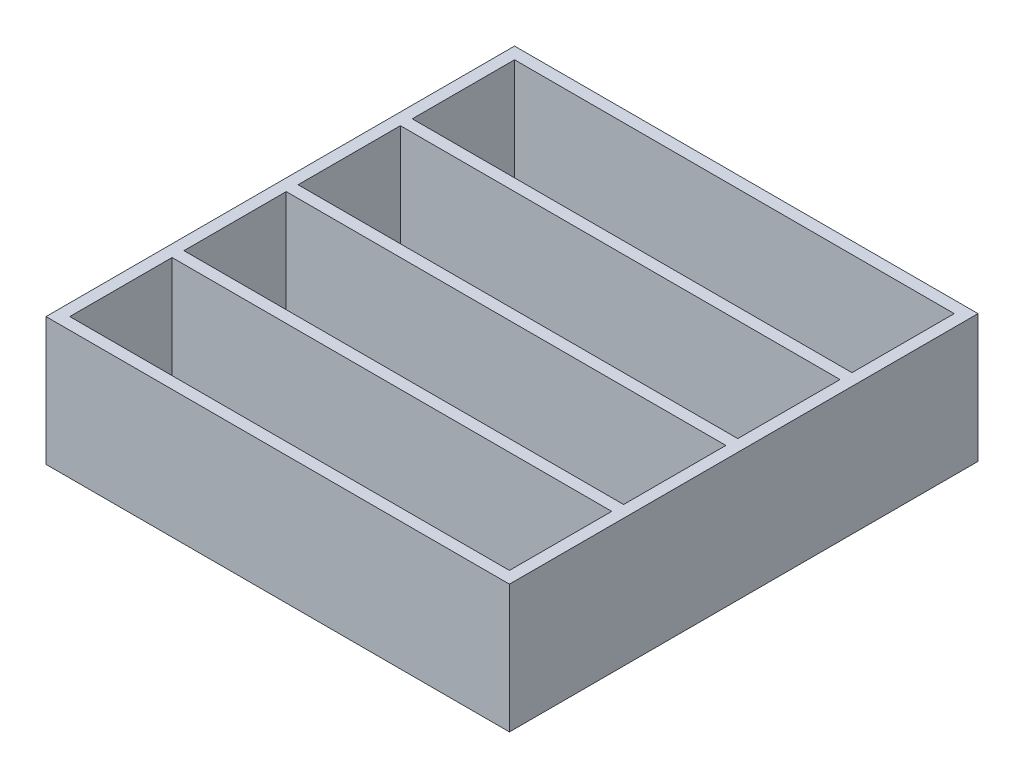
ISO-10303-21;
HEADER;
FILE_DESCRIPTION(('STEP AP214'),'2;1');
FILE_NAME('part.step','',(''),(''),'','','');
FILE_SCHEMA(('AUTOMOTIVE_DESIGN { 1 0 10303 214 1 1 1 1 }'));
ENDSEC;
DATA;
#1=APPLICATION_CONTEXT('core data for automotive mechanical design processes');
#2=APPLICATION_PROTOCOL_DEFINITION('international standard','automotive_design',2000,#1);
#3=PRODUCT_CONTEXT('',#1,'mechanical');
#4=PRODUCT('Part','Part','',(#3));
#5=PRODUCT_RELATED_PRODUCT_CATEGORY('part','',(#4));
#6=PRODUCT_DEFINITION_FORMATION('','',#4);
#7=PRODUCT_DEFINITION_CONTEXT('part definition',#1,'design');
#8=PRODUCT_DEFINITION('design','',#6,#7);
#9=PRODUCT_DEFINITION_SHAPE('','',#8);
#10=(LENGTH_UNIT() NAMED_UNIT(*) SI_UNIT(.MILLI.,.METRE.));
#11=(NAMED_UNIT(*) PLANE_ANGLE_UNIT() SI_UNIT($,.RADIAN.));
#12=(NAMED_UNIT(*) SI_UNIT($,.STERADIAN.) SOLID_ANGLE_UNIT());
#13=UNCERTAINTY_MEASURE_WITH_UNIT(LENGTH_MEASURE(1.E-05),#10,'distance_accuracy_value','');
#14=(GEOMETRIC_REPRESENTATION_CONTEXT(3) GLOBAL_UNCERTAINTY_ASSIGNED_CONTEXT((#13)) GLOBAL_UNIT_ASSIGNED_CONTEXT((#10,
#11,#12)) REPRESENTATION_CONTEXT('',''));
#15=CARTESIAN_POINT('',(0.,0.,0.));
#16=DIRECTION('',(0.,0.,1.));
#17=DIRECTION('',(1.,0.,0.));
#18=AXIS2_PLACEMENT_3D('',#15,#16,#17);
#19=CARTESIAN_POINT('',(-65.4717307692308,21.54,18.3833653846154));
#20=DIRECTION('',(1.,0.,0.));
#21=DIRECTION('',(0.,0.,-1.));
#22=AXIS2_PLACEMENT_3D('',#19,#20,#21);
#23=PLANE('',#22);
#24=DIRECTION('',(0.,0.,1.));
#25=VECTOR('',#24,1.);
#26=CARTESIAN_POINT('',(-65.4717307692308,0.,18.3833653846154));
#27=LINE('',#26,#25);
#28=CARTESIAN_POINT('',(-65.4717307692308,0.,-60.4566346153846));
#29=VERTEX_POINT('',#28);
#30=CARTESIAN_POINT('',(-65.4717307692308,0.,18.3833653846154));
#31=VERTEX_POINT('',#30);
#32=EDGE_CURVE('E222',#29,#31,#27,.T.);
#33=ORIENTED_EDGE('',*,*,#32,.T.);
#34=DIRECTION('',(0.,-1.,0.));
#35=VECTOR('',#34,1.);
#36=CARTESIAN_POINT('',(-65.4717307692308,21.54,18.3833653846154));
#37=LINE('',#36,#35);
#38=CARTESIAN_POINT('',(-65.4717307692308,21.54,18.3833653846154));
#39=VERTEX_POINT('',#38);
#40=EDGE_CURVE('E11',#39,#31,#37,.T.);
#41=ORIENTED_EDGE('',*,*,#40,.F.);
#42=DIRECTION('',(0.,0.,1.));
#43=VECTOR('',#42,1.);
#44=CARTESIAN_POINT('',(-65.4717307692308,21.54,18.3833653846154));
#45=LINE('',#44,#43);
#46=CARTESIAN_POINT('',(-65.4717307692308,21.54,-60.4566346153846));
#47=VERTEX_POINT('',#46);
#48=EDGE_CURVE('E357',#47,#39,#45,.T.);
#49=ORIENTED_EDGE('',*,*,#48,.F.);
#50=DIRECTION('',(0.,-1.,0.));
#51=VECTOR('',#50,1.);
#52=CARTESIAN_POINT('',(-65.4717307692308,21.54,-60.4566346153846));
#53=LINE('',#52,#51);
#54=EDGE_CURVE('E371',#47,#29,#53,.T.);
#55=ORIENTED_EDGE('',*,*,#54,.T.);
#56=EDGE_LOOP('',(#33,#41,#49,#55));
#57=FACE_BOUND('',#56,.T.);
#58=ADVANCED_FACE('F39',(#57),#23,.F.);
#59=CARTESIAN_POINT('',(-65.4717307692308,21.54,18.3833653846154));
#60=DIRECTION('',(0.,0.,-1.));
#61=DIRECTION('',(-1.,0.,0.));
#62=AXIS2_PLACEMENT_3D('',#59,#60,#61);
#63=PLANE('',#62);
#64=DIRECTION('',(1.,0.,0.));
#65=VECTOR('',#64,1.);
#66=CARTESIAN_POINT('',(-65.4717307692308,0.,18.3833653846154));
#67=LINE('',#66,#65);
#68=CARTESIAN_POINT('',(12.5082692307692,0.,18.3833653846154));
#69=VERTEX_POINT('',#68);
#70=EDGE_CURVE('E375',#31,#69,#67,.T.);
#71=ORIENTED_EDGE('',*,*,#70,.T.);
#72=DIRECTION('',(0.,-1.,0.));
#73=VECTOR('',#72,1.);
#74=CARTESIAN_POINT('',(12.5082692307692,21.54,18.3833653846154));
#75=LINE('',#74,#73);
#76=CARTESIAN_POINT('',(12.5082692307692,21.54,18.3833653846154));
#77=VERTEX_POINT('',#76);
#78=EDGE_CURVE('E47',#77,#69,#75,.T.);
#79=ORIENTED_EDGE('',*,*,#78,.F.);
#80=DIRECTION('',(1.,0.,0.));
#81=VECTOR('',#80,1.);
#82=CARTESIAN_POINT('',(-65.4717307692308,21.54,18.3833653846154));
#83=LINE('',#82,#81);
#84=EDGE_CURVE('E361',#39,#77,#83,.T.);
#85=ORIENTED_EDGE('',*,*,#84,.F.);
#86=ORIENTED_EDGE('',*,*,#40,.T.);
#87=EDGE_LOOP('',(#71,#79,#85,#86));
#88=FACE_BOUND('',#87,.T.);
#89=ADVANCED_FACE('F411',(#88),#63,.F.);
#90=CARTESIAN_POINT('',(12.5082692307692,21.54,18.3833653846154));
#91=DIRECTION('',(-1.,0.,0.));
#92=DIRECTION('',(0.,0.,1.));
#93=AXIS2_PLACEMENT_3D('',#90,#91,#92);
#94=PLANE('',#93);
#95=DIRECTION('',(0.,0.,-1.));
#96=VECTOR('',#95,1.);
#97=CARTESIAN_POINT('',(12.5082692307692,0.,18.3833653846154));
#98=LINE('',#97,#96);
#99=CARTESIAN_POINT('',(12.5082692307692,0.,-60.4566346153846));
#100=VERTEX_POINT('',#99);
#101=EDGE_CURVE('E378',#69,#100,#98,.T.);
#102=ORIENTED_EDGE('',*,*,#101,.T.);
#103=DIRECTION('',(0.,-1.,0.));
#104=VECTOR('',#103,1.);
#105=CARTESIAN_POINT('',(12.5082692307692,21.54,-60.4566346153846));
#106=LINE('',#105,#104);
#107=CARTESIAN_POINT('',(12.5082692307692,21.54,-60.4566346153846));
#108=VERTEX_POINT('',#107);
#109=EDGE_CURVE('E386',#108,#100,#106,.T.);
#110=ORIENTED_EDGE('',*,*,#109,.F.);
#111=DIRECTION('',(0.,0.,-1.));
#112=VECTOR('',#111,1.);
#113=CARTESIAN_POINT('',(12.5082692307692,21.54,18.3833653846154));
#114=LINE('',#113,#112);
#115=EDGE_CURVE('E365',#77,#108,#114,.T.);
#116=ORIENTED_EDGE('',*,*,#115,.F.);
#117=ORIENTED_EDGE('',*,*,#78,.T.);
#118=EDGE_LOOP('',(#102,#110,#116,#117));
#119=FACE_BOUND('',#118,.T.);
#120=ADVANCED_FACE('F395',(#119),#94,.F.);
#121=CARTESIAN_POINT('',(-65.4717307692308,21.54,-60.4566346153846));
#122=DIRECTION('',(0.,0.,1.));
#123=DIRECTION('',(1.,0.,0.));
#124=AXIS2_PLACEMENT_3D('',#121,#122,#123);
#125=PLANE('',#124);
#126=DIRECTION('',(-1.,0.,0.));
#127=VECTOR('',#126,1.);
#128=CARTESIAN_POINT('',(-65.4717307692308,0.,-60.4566346153846));
#129=LINE('',#128,#127);
#130=EDGE_CURVE('E362',#100,#29,#129,.T.);
#131=ORIENTED_EDGE('',*,*,#130,.T.);
#132=ORIENTED_EDGE('',*,*,#54,.F.);
#133=DIRECTION('',(-1.,0.,0.));
#134=VECTOR('',#133,1.);
#135=CARTESIAN_POINT('',(-65.4717307692308,21.54,-60.4566346153846));
#136=LINE('',#135,#134);
#137=EDGE_CURVE('E368',#108,#47,#136,.T.);
#138=ORIENTED_EDGE('',*,*,#137,.F.);
#139=ORIENTED_EDGE('',*,*,#109,.T.);
#140=EDGE_LOOP('',(#131,#132,#138,#139));
#141=FACE_BOUND('',#140,.T.);
#142=ADVANCED_FACE('F404',(#141),#125,.F.);
#143=CARTESIAN_POINT('',(0.,21.54,0.));
#144=DIRECTION('',(0.,-1.,0.));
#145=DIRECTION('',(0.,0.,-1.));
#146=AXIS2_PLACEMENT_3D('',#143,#144,#145);
#147=PLANE('',#146);
#148=DIRECTION('',(-1.,0.,0.));
#149=VECTOR('',#148,1.);
#150=CARTESIAN_POINT('',(10.5082692307692,21.54,-0.826634615384606));
#151=LINE('',#150,#149);
#152=CARTESIAN_POINT('',(10.5082692307692,21.54,-0.826634615384606));
#153=VERTEX_POINT('',#152);
#154=CARTESIAN_POINT('',(-63.4717307692308,21.54,-0.826634615384597));
#155=VERTEX_POINT('',#154);
#156=EDGE_CURVE('E212',#153,#155,#151,.T.);
#157=ORIENTED_EDGE('',*,*,#156,.F.);
#158=DIRECTION('',(0.,0.,-1.));
#159=VECTOR('',#158,1.);
#160=CARTESIAN_POINT('',(10.5082692307692,21.54,16.3833653846154));
#161=LINE('',#160,#159);
#162=CARTESIAN_POINT('',(10.5082692307692,21.54,16.3833653846154));
#163=VERTEX_POINT('',#162);
#164=EDGE_CURVE('E54',#163,#153,#161,.T.);
#165=ORIENTED_EDGE('',*,*,#164,.F.);
#166=DIRECTION('',(1.,0.,0.));
#167=VECTOR('',#166,1.);
#168=CARTESIAN_POINT('',(10.5082692307692,21.54,16.3833653846154));
#169=LINE('',#168,#167);
#170=CARTESIAN_POINT('',(-63.4717307692308,21.54,16.3833653846154));
#171=VERTEX_POINT('',#170);
#172=EDGE_CURVE('E199',#171,#163,#169,.T.);
#173=ORIENTED_EDGE('',*,*,#172,.F.);
#174=DIRECTION('',(0.,0.,1.));
#175=VECTOR('',#174,1.);
#176=CARTESIAN_POINT('',(-63.4717307692308,21.54,16.3833653846154));
#177=LINE('',#176,#175);
#178=EDGE_CURVE('E203',#155,#171,#177,.T.);
#179=ORIENTED_EDGE('',*,*,#178,.F.);
#180=EDGE_LOOP('',(#157,#165,#173,#179));
#181=FACE_BOUND('',#180,.T.);
#182=DIRECTION('',(-1.,0.,0.));
#183=VECTOR('',#182,1.);
#184=CARTESIAN_POINT('',(10.5082692307692,21.54,-20.0366346153846));
#185=LINE('',#184,#183);
#186=CARTESIAN_POINT('',(10.5082692307692,21.54,-20.0366346153846));
#187=VERTEX_POINT('',#186);
#188=CARTESIAN_POINT('',(-63.4717307692308,21.54,-20.0366346153846));
#189=VERTEX_POINT('',#188);
#190=EDGE_CURVE('E248',#187,#189,#185,.T.);
#191=ORIENTED_EDGE('',*,*,#190,.F.);
#192=DIRECTION('',(0.,0.,-1.));
#193=VECTOR('',#192,1.);
#194=CARTESIAN_POINT('',(10.5082692307692,21.54,-2.82663461538461));
#195=LINE('',#194,#193);
#196=CARTESIAN_POINT('',(10.5082692307692,21.54,-2.82663461538461));
#197=VERTEX_POINT('',#196);
#198=EDGE_CURVE('E62',#197,#187,#195,.T.);
#199=ORIENTED_EDGE('',*,*,#198,.F.);
#200=DIRECTION('',(1.,0.,0.));
#201=VECTOR('',#200,1.);
#202=CARTESIAN_POINT('',(10.5082692307692,21.54,-2.82663461538461));
#203=LINE('',#202,#201);
#204=CARTESIAN_POINT('',(-63.4717307692308,21.54,-2.8266346153846));
#205=VERTEX_POINT('',#204);
#206=EDGE_CURVE('E233',#205,#197,#203,.T.);
#207=ORIENTED_EDGE('',*,*,#206,.F.);
#208=DIRECTION('',(0.,0.,1.));
#209=VECTOR('',#208,1.);
#210=CARTESIAN_POINT('',(-63.4717307692308,21.54,-2.8266346153846));
#211=LINE('',#210,#209);
#212=EDGE_CURVE('E253',#189,#205,#211,.T.);
#213=ORIENTED_EDGE('',*,*,#212,.F.);
#214=EDGE_LOOP('',(#191,#199,#207,#213));
#215=FACE_BOUND('',#214,.T.);
#216=DIRECTION('',(-1.,0.,0.));
#217=VECTOR('',#216,1.);
#218=CARTESIAN_POINT('',(10.5082692307692,21.54,-39.2466346153847));
#219=LINE('',#218,#217);
#220=CARTESIAN_POINT('',(10.5082692307692,21.54,-39.2466346153847));
#221=VERTEX_POINT('',#220);
#222=CARTESIAN_POINT('',(-63.4717307692308,21.54,-39.2466346153846));
#223=VERTEX_POINT('',#222);
#224=EDGE_CURVE('E291',#221,#223,#219,.T.);
#225=ORIENTED_EDGE('',*,*,#224,.F.);
#226=DIRECTION('',(0.,0.,-1.));
#227=VECTOR('',#226,1.);
#228=CARTESIAN_POINT('',(10.5082692307692,21.54,-22.0366346153846));
#229=LINE('',#228,#227);
#230=CARTESIAN_POINT('',(10.5082692307692,21.54,-22.0366346153846));
#231=VERTEX_POINT('',#230);
#232=EDGE_CURVE('E288',#231,#221,#229,.T.);
#233=ORIENTED_EDGE('',*,*,#232,.F.);
#234=DIRECTION('',(1.,0.,0.));
#235=VECTOR('',#234,1.);
#236=CARTESIAN_POINT('',(10.5082692307692,21.54,-22.0366346153846));
#237=LINE('',#236,#235);
#238=CARTESIAN_POINT('',(-63.4717307692308,21.54,-22.0366346153846));
#239=VERTEX_POINT('',#238);
#240=EDGE_CURVE('E275',#239,#231,#237,.T.);
#241=ORIENTED_EDGE('',*,*,#240,.F.);
#242=DIRECTION('',(0.,0.,1.));
#243=VECTOR('',#242,1.);
#244=CARTESIAN_POINT('',(-63.4717307692308,21.54,-22.0366346153846));
#245=LINE('',#244,#243);
#246=EDGE_CURVE('E296',#223,#239,#245,.T.);
#247=ORIENTED_EDGE('',*,*,#246,.F.);
#248=EDGE_LOOP('',(#225,#233,#241,#247));
#249=FACE_BOUND('',#248,.T.);
#250=DIRECTION('',(-1.,0.,0.));
#251=VECTOR('',#250,1.);
#252=CARTESIAN_POINT('',(10.5082692307692,21.54,-58.4566346153846));
#253=LINE('',#252,#251);
#254=CARTESIAN_POINT('',(10.5082692307692,21.54,-58.4566346153846));
#255=VERTEX_POINT('',#254);
#256=CARTESIAN_POINT('',(-63.4717307692308,21.54,-58.4566346153846));
#257=VERTEX_POINT('',#256);
#258=EDGE_CURVE('E335',#255,#257,#253,.T.);
#259=ORIENTED_EDGE('',*,*,#258,.F.);
#260=DIRECTION('',(0.,0.,-1.));
#261=VECTOR('',#260,1.);
#262=CARTESIAN_POINT('',(10.5082692307692,21.54,-41.2466346153847));
#263=LINE('',#262,#261);
#264=CARTESIAN_POINT('',(10.5082692307692,21.54,-41.2466346153847));
#265=VERTEX_POINT('',#264);
#266=EDGE_CURVE('E332',#265,#255,#263,.T.);
#267=ORIENTED_EDGE('',*,*,#266,.F.);
#268=DIRECTION('',(1.,0.,0.));
#269=VECTOR('',#268,1.);
#270=CARTESIAN_POINT('',(10.5082692307692,21.54,-41.2466346153847));
#271=LINE('',#270,#269);
#272=CARTESIAN_POINT('',(-63.4717307692308,21.54,-41.2466346153846));
#273=VERTEX_POINT('',#272);
#274=EDGE_CURVE('E319',#273,#265,#271,.T.);
#275=ORIENTED_EDGE('',*,*,#274,.F.);
#276=DIRECTION('',(0.,0.,1.));
#277=VECTOR('',#276,1.);
#278=CARTESIAN_POINT('',(-63.4717307692308,21.54,-41.2466346153846));
#279=LINE('',#278,#277);
#280=EDGE_CURVE('E339',#257,#273,#279,.T.);
#281=ORIENTED_EDGE('',*,*,#280,.F.);
#282=EDGE_LOOP('',(#259,#267,#275,#281));
#283=FACE_BOUND('',#282,.T.);
#284=ORIENTED_EDGE('',*,*,#48,.T.);
#285=ORIENTED_EDGE('',*,*,#84,.T.);
#286=ORIENTED_EDGE('',*,*,#115,.T.);
#287=ORIENTED_EDGE('',*,*,#137,.T.);
#288=EDGE_LOOP('',(#284,#285,#286,#287));
#289=FACE_BOUND('',#288,.T.);
#290=ADVANCED_FACE('F410',(#181,#215,#249,#283,#289),#147,.F.);
#291=CARTESIAN_POINT('',(0.,0.,0.));
#292=DIRECTION('',(0.,-1.,0.));
#293=DIRECTION('',(0.,0.,-1.));
#294=AXIS2_PLACEMENT_3D('',#291,#292,#293);
#295=PLANE('',#294);
#296=ORIENTED_EDGE('',*,*,#32,.F.);
#297=ORIENTED_EDGE('',*,*,#130,.F.);
#298=ORIENTED_EDGE('',*,*,#101,.F.);
#299=ORIENTED_EDGE('',*,*,#70,.F.);
#300=EDGE_LOOP('',(#296,#297,#298,#299));
#301=FACE_BOUND('',#300,.T.);
#302=ADVANCED_FACE('F401',(#301),#295,.T.);
#303=CARTESIAN_POINT('',(10.5082692307692,2.,-41.2466346153847));
#304=DIRECTION('',(1.,0.,0.));
#305=DIRECTION('',(0.,0.,-1.));
#306=AXIS2_PLACEMENT_3D('',#303,#304,#305);
#307=PLANE('',#306);
#308=ORIENTED_EDGE('',*,*,#266,.T.);
#309=DIRECTION('',(0.,1.,0.));
#310=VECTOR('',#309,1.);
#311=CARTESIAN_POINT('',(10.5082692307692,2.,-58.4566346153846));
#312=LINE('',#311,#310);
#313=CARTESIAN_POINT('',(10.5082692307692,2.,-58.4566346153846));
#314=VERTEX_POINT('',#313);
#315=EDGE_CURVE('E331',#314,#255,#312,.T.);
#316=ORIENTED_EDGE('',*,*,#315,.F.);
#317=DIRECTION('',(0.,0.,-1.));
#318=VECTOR('',#317,1.);
#319=CARTESIAN_POINT('',(10.5082692307692,2.,-41.2466346153847));
#320=LINE('',#319,#318);
#321=CARTESIAN_POINT('',(10.5082692307692,2.,-41.2466346153847));
#322=VERTEX_POINT('',#321);
#323=EDGE_CURVE('E314',#322,#314,#320,.T.);
#324=ORIENTED_EDGE('',*,*,#323,.F.);
#325=DIRECTION('',(0.,1.,0.));
#326=VECTOR('',#325,1.);
#327=CARTESIAN_POINT('',(10.5082692307692,2.,-41.2466346153847));
#328=LINE('',#327,#326);
#329=EDGE_CURVE('E292',#322,#265,#328,.T.);
#330=ORIENTED_EDGE('',*,*,#329,.T.);
#331=EDGE_LOOP('',(#308,#316,#324,#330));
#332=FACE_BOUND('',#331,.T.);
#333=ADVANCED_FACE('F423',(#332),#307,.F.);
#334=CARTESIAN_POINT('',(10.5082692307692,2.,-41.2466346153847));
#335=DIRECTION('',(0.,0.,1.));
#336=DIRECTION('',(1.,0.,0.));
#337=AXIS2_PLACEMENT_3D('',#334,#335,#336);
#338=PLANE('',#337);
#339=ORIENTED_EDGE('',*,*,#274,.T.);
#340=ORIENTED_EDGE('',*,*,#329,.F.);
#341=DIRECTION('',(1.,0.,0.));
#342=VECTOR('',#341,1.);
#343=CARTESIAN_POINT('',(10.5082692307692,2.,-41.2466346153847));
#344=LINE('',#343,#342);
#345=CARTESIAN_POINT('',(-63.4717307692308,2.,-41.2466346153846));
#346=VERTEX_POINT('',#345);
#347=EDGE_CURVE('E327',#346,#322,#344,.T.);
#348=ORIENTED_EDGE('',*,*,#347,.F.);
#349=DIRECTION('',(0.,1.,0.));
#350=VECTOR('',#349,1.);
#351=CARTESIAN_POINT('',(-63.4717307692308,2.,-41.2466346153846));
#352=LINE('',#351,#350);
#353=EDGE_CURVE('E348',#346,#273,#352,.T.);
#354=ORIENTED_EDGE('',*,*,#353,.T.);
#355=EDGE_LOOP('',(#339,#340,#348,#354));
#356=FACE_BOUND('',#355,.T.);
#357=ADVANCED_FACE('F429',(#356),#338,.F.);
#358=CARTESIAN_POINT('',(-63.4717307692308,2.,-41.2466346153846));
#359=DIRECTION('',(-1.,0.,0.));
#360=DIRECTION('',(0.,0.,1.));
#361=AXIS2_PLACEMENT_3D('',#358,#359,#360);
#362=PLANE('',#361);
#363=ORIENTED_EDGE('',*,*,#280,.T.);
#364=ORIENTED_EDGE('',*,*,#353,.F.);
#365=DIRECTION('',(0.,0.,1.));
#366=VECTOR('',#365,1.);
#367=CARTESIAN_POINT('',(-63.4717307692308,2.,-41.2466346153846));
#368=LINE('',#367,#366);
#369=CARTESIAN_POINT('',(-63.4717307692308,2.,-58.4566346153846));
#370=VERTEX_POINT('',#369);
#371=EDGE_CURVE('E323',#370,#346,#368,.T.);
#372=ORIENTED_EDGE('',*,*,#371,.F.);
#373=DIRECTION('',(0.,1.,0.));
#374=VECTOR('',#373,1.);
#375=CARTESIAN_POINT('',(-63.4717307692308,2.,-58.4566346153846));
#376=LINE('',#375,#374);
#377=EDGE_CURVE('E351',#370,#257,#376,.T.);
#378=ORIENTED_EDGE('',*,*,#377,.T.);
#379=EDGE_LOOP('',(#363,#364,#372,#378));
#380=FACE_BOUND('',#379,.T.);
#381=ADVANCED_FACE('F435',(#380),#362,.F.);
#382=CARTESIAN_POINT('',(10.5082692307692,2.,-58.4566346153846));
#383=DIRECTION('',(0.,0.,-1.));
#384=DIRECTION('',(-1.,0.,0.));
#385=AXIS2_PLACEMENT_3D('',#382,#383,#384);
#386=PLANE('',#385);
#387=ORIENTED_EDGE('',*,*,#258,.T.);
#388=ORIENTED_EDGE('',*,*,#377,.F.);
#389=DIRECTION('',(-1.,0.,0.));
#390=VECTOR('',#389,1.);
#391=CARTESIAN_POINT('',(10.5082692307692,2.,-58.4566346153846));
#392=LINE('',#391,#390);
#393=EDGE_CURVE('E318',#314,#370,#392,.T.);
#394=ORIENTED_EDGE('',*,*,#393,.F.);
#395=ORIENTED_EDGE('',*,*,#315,.T.);
#396=EDGE_LOOP('',(#387,#388,#394,#395));
#397=FACE_BOUND('',#396,.T.);
#398=ADVANCED_FACE('F431',(#397),#386,.F.);
#399=CARTESIAN_POINT('',(0.,2.,0.));
#400=DIRECTION('',(0.,1.,0.));
#401=DIRECTION('',(0.,0.,1.));
#402=AXIS2_PLACEMENT_3D('',#399,#400,#401);
#403=PLANE('',#402);
#404=ORIENTED_EDGE('',*,*,#323,.T.);
#405=ORIENTED_EDGE('',*,*,#393,.T.);
#406=ORIENTED_EDGE('',*,*,#371,.T.);
#407=ORIENTED_EDGE('',*,*,#347,.T.);
#408=EDGE_LOOP('',(#404,#405,#406,#407));
#409=FACE_BOUND('',#408,.T.);
#410=ADVANCED_FACE('F434',(#409),#403,.T.);
#411=CARTESIAN_POINT('',(10.5082692307692,2.,-22.0366346153846));
#412=DIRECTION('',(1.,0.,0.));
#413=DIRECTION('',(0.,0.,-1.));
#414=AXIS2_PLACEMENT_3D('',#411,#412,#413);
#415=PLANE('',#414);
#416=ORIENTED_EDGE('',*,*,#232,.T.);
#417=DIRECTION('',(0.,1.,0.));
#418=VECTOR('',#417,1.);
#419=CARTESIAN_POINT('',(10.5082692307692,2.,-39.2466346153847));
#420=LINE('',#419,#418);
#421=CARTESIAN_POINT('',(10.5082692307692,2.,-39.2466346153847));
#422=VERTEX_POINT('',#421);
#423=EDGE_CURVE('E287',#422,#221,#420,.T.);
#424=ORIENTED_EDGE('',*,*,#423,.F.);
#425=DIRECTION('',(0.,0.,-1.));
#426=VECTOR('',#425,1.);
#427=CARTESIAN_POINT('',(10.5082692307692,2.,-22.0366346153846));
#428=LINE('',#427,#426);
#429=CARTESIAN_POINT('',(10.5082692307692,2.,-22.0366346153846));
#430=VERTEX_POINT('',#429);
#431=EDGE_CURVE('E270',#430,#422,#428,.T.);
#432=ORIENTED_EDGE('',*,*,#431,.F.);
#433=DIRECTION('',(0.,1.,0.));
#434=VECTOR('',#433,1.);
#435=CARTESIAN_POINT('',(10.5082692307692,2.,-22.0366346153846));
#436=LINE('',#435,#434);
#437=EDGE_CURVE('E249',#430,#231,#436,.T.);
#438=ORIENTED_EDGE('',*,*,#437,.T.);
#439=EDGE_LOOP('',(#416,#424,#432,#438));
#440=FACE_BOUND('',#439,.T.);
#441=ADVANCED_FACE('F445',(#440),#415,.F.);
#442=CARTESIAN_POINT('',(10.5082692307692,2.,-22.0366346153846));
#443=DIRECTION('',(0.,0.,1.));
#444=DIRECTION('',(1.,0.,0.));
#445=AXIS2_PLACEMENT_3D('',#442,#443,#444);
#446=PLANE('',#445);
#447=ORIENTED_EDGE('',*,*,#240,.T.);
#448=ORIENTED_EDGE('',*,*,#437,.F.);
#449=DIRECTION('',(1.,0.,0.));
#450=VECTOR('',#449,1.);
#451=CARTESIAN_POINT('',(10.5082692307692,2.,-22.0366346153846));
#452=LINE('',#451,#450);
#453=CARTESIAN_POINT('',(-63.4717307692308,2.,-22.0366346153846));
#454=VERTEX_POINT('',#453);
#455=EDGE_CURVE('E283',#454,#430,#452,.T.);
#456=ORIENTED_EDGE('',*,*,#455,.F.);
#457=DIRECTION('',(0.,1.,0.));
#458=VECTOR('',#457,1.);
#459=CARTESIAN_POINT('',(-63.4717307692308,2.,-22.0366346153846));
#460=LINE('',#459,#458);
#461=EDGE_CURVE('E305',#454,#239,#460,.T.);
#462=ORIENTED_EDGE('',*,*,#461,.T.);
#463=EDGE_LOOP('',(#447,#448,#456,#462));
#464=FACE_BOUND('',#463,.T.);
#465=ADVANCED_FACE('F449',(#464),#446,.F.);
#466=CARTESIAN_POINT('',(-63.4717307692308,2.,-22.0366346153846));
#467=DIRECTION('',(-1.,0.,0.));
#468=DIRECTION('',(0.,0.,1.));
#469=AXIS2_PLACEMENT_3D('',#466,#467,#468);
#470=PLANE('',#469);
#471=ORIENTED_EDGE('',*,*,#246,.T.);
#472=ORIENTED_EDGE('',*,*,#461,.F.);
#473=DIRECTION('',(0.,0.,1.));
#474=VECTOR('',#473,1.);
#475=CARTESIAN_POINT('',(-63.4717307692308,2.,-22.0366346153846));
#476=LINE('',#475,#474);
#477=CARTESIAN_POINT('',(-63.4717307692308,2.,-39.2466346153846));
#478=VERTEX_POINT('',#477);
#479=EDGE_CURVE('E279',#478,#454,#476,.T.);
#480=ORIENTED_EDGE('',*,*,#479,.F.);
#481=DIRECTION('',(0.,1.,0.));
#482=VECTOR('',#481,1.);
#483=CARTESIAN_POINT('',(-63.4717307692308,2.,-39.2466346153846));
#484=LINE('',#483,#482);
#485=EDGE_CURVE('E308',#478,#223,#484,.T.);
#486=ORIENTED_EDGE('',*,*,#485,.T.);
#487=EDGE_LOOP('',(#471,#472,#480,#486));
#488=FACE_BOUND('',#487,.T.);
#489=ADVANCED_FACE('F455',(#488),#470,.F.);
#490=CARTESIAN_POINT('',(10.5082692307692,2.,-39.2466346153847));
#491=DIRECTION('',(0.,0.,-1.));
#492=DIRECTION('',(-1.,0.,0.));
#493=AXIS2_PLACEMENT_3D('',#490,#491,#492);
#494=PLANE('',#493);
#495=ORIENTED_EDGE('',*,*,#224,.T.);
#496=ORIENTED_EDGE('',*,*,#485,.F.);
#497=DIRECTION('',(-1.,0.,0.));
#498=VECTOR('',#497,1.);
#499=CARTESIAN_POINT('',(10.5082692307692,2.,-39.2466346153847));
#500=LINE('',#499,#498);
#501=EDGE_CURVE('E274',#422,#478,#500,.T.);
#502=ORIENTED_EDGE('',*,*,#501,.F.);
#503=ORIENTED_EDGE('',*,*,#423,.T.);
#504=EDGE_LOOP('',(#495,#496,#502,#503));
#505=FACE_BOUND('',#504,.T.);
#506=ADVANCED_FACE('F451',(#505),#494,.F.);
#507=CARTESIAN_POINT('',(0.,2.,0.));
#508=DIRECTION('',(0.,1.,0.));
#509=DIRECTION('',(0.,0.,1.));
#510=AXIS2_PLACEMENT_3D('',#507,#508,#509);
#511=PLANE('',#510);
#512=ORIENTED_EDGE('',*,*,#431,.T.);
#513=ORIENTED_EDGE('',*,*,#501,.T.);
#514=ORIENTED_EDGE('',*,*,#479,.T.);
#515=ORIENTED_EDGE('',*,*,#455,.T.);
#516=EDGE_LOOP('',(#512,#513,#514,#515));
#517=FACE_BOUND('',#516,.T.);
#518=ADVANCED_FACE('F454',(#517),#511,.T.);
#519=CARTESIAN_POINT('',(10.5082692307692,2.,-2.82663461538461));
#520=DIRECTION('',(1.,0.,0.));
#521=DIRECTION('',(0.,0.,-1.));
#522=AXIS2_PLACEMENT_3D('',#519,#520,#521);
#523=PLANE('',#522);
#524=ORIENTED_EDGE('',*,*,#198,.T.);
#525=DIRECTION('',(0.,1.,0.));
#526=VECTOR('',#525,1.);
#527=CARTESIAN_POINT('',(10.5082692307692,2.,-20.0366346153846));
#528=LINE('',#527,#526);
#529=CARTESIAN_POINT('',(10.5082692307692,2.,-20.0366346153846));
#530=VERTEX_POINT('',#529);
#531=EDGE_CURVE('E245',#530,#187,#528,.T.);
#532=ORIENTED_EDGE('',*,*,#531,.F.);
#533=DIRECTION('',(0.,0.,-1.));
#534=VECTOR('',#533,1.);
#535=CARTESIAN_POINT('',(10.5082692307692,2.,-2.82663461538461));
#536=LINE('',#535,#534);
#537=CARTESIAN_POINT('',(10.5082692307692,2.,-2.82663461538461));
#538=VERTEX_POINT('',#537);
#539=EDGE_CURVE('E228',#538,#530,#536,.T.);
#540=ORIENTED_EDGE('',*,*,#539,.F.);
#541=DIRECTION('',(0.,1.,0.));
#542=VECTOR('',#541,1.);
#543=CARTESIAN_POINT('',(10.5082692307692,2.,-2.82663461538461));
#544=LINE('',#543,#542);
#545=EDGE_CURVE('E213',#538,#197,#544,.T.);
#546=ORIENTED_EDGE('',*,*,#545,.T.);
#547=EDGE_LOOP('',(#524,#532,#540,#546));
#548=FACE_BOUND('',#547,.T.);
#549=ADVANCED_FACE('F465',(#548),#523,.F.);
#550=CARTESIAN_POINT('',(10.5082692307692,2.,-2.82663461538461));
#551=DIRECTION('',(0.,0.,1.));
#552=DIRECTION('',(1.,0.,0.));
#553=AXIS2_PLACEMENT_3D('',#550,#551,#552);
#554=PLANE('',#553);
#555=ORIENTED_EDGE('',*,*,#206,.T.);
#556=ORIENTED_EDGE('',*,*,#545,.F.);
#557=DIRECTION('',(1.,0.,0.));
#558=VECTOR('',#557,1.);
#559=CARTESIAN_POINT('',(10.5082692307692,2.,-2.82663461538461));
#560=LINE('',#559,#558);
#561=CARTESIAN_POINT('',(-63.4717307692308,2.,-2.8266346153846));
#562=VERTEX_POINT('',#561);
#563=EDGE_CURVE('E241',#562,#538,#560,.T.);
#564=ORIENTED_EDGE('',*,*,#563,.F.);
#565=DIRECTION('',(0.,1.,0.));
#566=VECTOR('',#565,1.);
#567=CARTESIAN_POINT('',(-63.4717307692308,2.,-2.8266346153846));
#568=LINE('',#567,#566);
#569=EDGE_CURVE('E262',#562,#205,#568,.T.);
#570=ORIENTED_EDGE('',*,*,#569,.T.);
#571=EDGE_LOOP('',(#555,#556,#564,#570));
#572=FACE_BOUND('',#571,.T.);
#573=ADVANCED_FACE('F469',(#572),#554,.F.);
#574=CARTESIAN_POINT('',(-63.4717307692308,2.,-2.8266346153846));
#575=DIRECTION('',(-1.,0.,0.));
#576=DIRECTION('',(0.,0.,1.));
#577=AXIS2_PLACEMENT_3D('',#574,#575,#576);
#578=PLANE('',#577);
#579=ORIENTED_EDGE('',*,*,#212,.T.);
#580=ORIENTED_EDGE('',*,*,#569,.F.);
#581=DIRECTION('',(0.,0.,1.));
#582=VECTOR('',#581,1.);
#583=CARTESIAN_POINT('',(-63.4717307692308,2.,-2.8266346153846));
#584=LINE('',#583,#582);
#585=CARTESIAN_POINT('',(-63.4717307692308,2.,-20.0366346153846));
#586=VERTEX_POINT('',#585);
#587=EDGE_CURVE('E237',#586,#562,#584,.T.);
#588=ORIENTED_EDGE('',*,*,#587,.F.);
#589=DIRECTION('',(0.,1.,0.));
#590=VECTOR('',#589,1.);
#591=CARTESIAN_POINT('',(-63.4717307692308,2.,-20.0366346153846));
#592=LINE('',#591,#590);
#593=EDGE_CURVE('E265',#586,#189,#592,.T.);
#594=ORIENTED_EDGE('',*,*,#593,.T.);
#595=EDGE_LOOP('',(#579,#580,#588,#594));
#596=FACE_BOUND('',#595,.T.);
#597=ADVANCED_FACE('F474',(#596),#578,.F.);
#598=CARTESIAN_POINT('',(10.5082692307692,2.,-20.0366346153846));
#599=DIRECTION('',(0.,0.,-1.));
#600=DIRECTION('',(-1.,0.,0.));
#601=AXIS2_PLACEMENT_3D('',#598,#599,#600);
#602=PLANE('',#601);
#603=ORIENTED_EDGE('',*,*,#190,.T.);
#604=ORIENTED_EDGE('',*,*,#593,.F.);
#605=DIRECTION('',(-1.,0.,0.));
#606=VECTOR('',#605,1.);
#607=CARTESIAN_POINT('',(10.5082692307692,2.,-20.0366346153846));
#608=LINE('',#607,#606);
#609=EDGE_CURVE('E232',#530,#586,#608,.T.);
#610=ORIENTED_EDGE('',*,*,#609,.F.);
#611=ORIENTED_EDGE('',*,*,#531,.T.);
#612=EDGE_LOOP('',(#603,#604,#610,#611));
#613=FACE_BOUND('',#612,.T.);
#614=ADVANCED_FACE('F470',(#613),#602,.F.);
#615=CARTESIAN_POINT('',(0.,2.,0.));
#616=DIRECTION('',(0.,1.,0.));
#617=DIRECTION('',(0.,0.,1.));
#618=AXIS2_PLACEMENT_3D('',#615,#616,#617);
#619=PLANE('',#618);
#620=ORIENTED_EDGE('',*,*,#539,.T.);
#621=ORIENTED_EDGE('',*,*,#609,.T.);
#622=ORIENTED_EDGE('',*,*,#587,.T.);
#623=ORIENTED_EDGE('',*,*,#563,.T.);
#624=EDGE_LOOP('',(#620,#621,#622,#623));
#625=FACE_BOUND('',#624,.T.);
#626=ADVANCED_FACE('F473',(#625),#619,.T.);
#627=CARTESIAN_POINT('',(10.5082692307692,2.,16.3833653846154));
#628=DIRECTION('',(1.,0.,0.));
#629=DIRECTION('',(0.,0.,-1.));
#630=AXIS2_PLACEMENT_3D('',#627,#628,#629);
#631=PLANE('',#630);
#632=ORIENTED_EDGE('',*,*,#164,.T.);
#633=DIRECTION('',(0.,1.,0.));
#634=VECTOR('',#633,1.);
#635=CARTESIAN_POINT('',(10.5082692307692,2.,-0.826634615384606));
#636=LINE('',#635,#634);
#637=CARTESIAN_POINT('',(10.5082692307692,2.,-0.826634615384606));
#638=VERTEX_POINT('',#637);
#639=EDGE_CURVE('E174',#638,#153,#636,.T.);
#640=ORIENTED_EDGE('',*,*,#639,.F.);
#641=DIRECTION('',(0.,0.,-1.));
#642=VECTOR('',#641,1.);
#643=CARTESIAN_POINT('',(10.5082692307692,2.,16.3833653846154));
#644=LINE('',#643,#642);
#645=CARTESIAN_POINT('',(10.5082692307692,2.,16.3833653846154));
#646=VERTEX_POINT('',#645);
#647=EDGE_CURVE('E178',#646,#638,#644,.T.);
#648=ORIENTED_EDGE('',*,*,#647,.F.);
#649=DIRECTION('',(0.,1.,0.));
#650=VECTOR('',#649,1.);
#651=CARTESIAN_POINT('',(10.5082692307692,2.,16.3833653846154));
#652=LINE('',#651,#650);
#653=EDGE_CURVE('E219',#646,#163,#652,.T.);
#654=ORIENTED_EDGE('',*,*,#653,.T.);
#655=EDGE_LOOP('',(#632,#640,#648,#654));
#656=FACE_BOUND('',#655,.T.);
#657=ADVANCED_FACE('F176',(#656),#631,.F.);
#658=CARTESIAN_POINT('',(10.5082692307692,2.,16.3833653846154));
#659=DIRECTION('',(0.,0.,1.));
#660=DIRECTION('',(1.,0.,0.));
#661=AXIS2_PLACEMENT_3D('',#658,#659,#660);
#662=PLANE('',#661);
#663=ORIENTED_EDGE('',*,*,#172,.T.);
#664=ORIENTED_EDGE('',*,*,#653,.F.);
#665=DIRECTION('',(1.,0.,0.));
#666=VECTOR('',#665,1.);
#667=CARTESIAN_POINT('',(10.5082692307692,2.,16.3833653846154));
#668=LINE('',#667,#666);
#669=CARTESIAN_POINT('',(-63.4717307692308,2.,16.3833653846154));
#670=VERTEX_POINT('',#669);
#671=EDGE_CURVE('E185',#670,#646,#668,.T.);
#672=ORIENTED_EDGE('',*,*,#671,.F.);
#673=DIRECTION('',(0.,1.,0.));
#674=VECTOR('',#673,1.);
#675=CARTESIAN_POINT('',(-63.4717307692308,2.,16.3833653846154));
#676=LINE('',#675,#674);
#677=EDGE_CURVE('E223',#670,#171,#676,.T.);
#678=ORIENTED_EDGE('',*,*,#677,.T.);
#679=EDGE_LOOP('',(#663,#664,#672,#678));
#680=FACE_BOUND('',#679,.T.);
#681=ADVANCED_FACE('F487',(#680),#662,.F.);
#682=CARTESIAN_POINT('',(-63.4717307692308,2.,16.3833653846154));
#683=DIRECTION('',(-1.,0.,0.));
#684=DIRECTION('',(0.,0.,1.));
#685=AXIS2_PLACEMENT_3D('',#682,#683,#684);
#686=PLANE('',#685);
#687=ORIENTED_EDGE('',*,*,#178,.T.);
#688=ORIENTED_EDGE('',*,*,#677,.F.);
#689=DIRECTION('',(0.,0.,1.));
#690=VECTOR('',#689,1.);
#691=CARTESIAN_POINT('',(-63.4717307692308,2.,16.3833653846154));
#692=LINE('',#691,#690);
#693=CARTESIAN_POINT('',(-63.4717307692308,2.,-0.826634615384597));
#694=VERTEX_POINT('',#693);
#695=EDGE_CURVE('E194',#694,#670,#692,.T.);
#696=ORIENTED_EDGE('',*,*,#695,.F.);
#697=DIRECTION('',(0.,1.,0.));
#698=VECTOR('',#697,1.);
#699=CARTESIAN_POINT('',(-63.4717307692308,2.,-0.826634615384597));
#700=LINE('',#699,#698);
#701=EDGE_CURVE('E184',#694,#155,#700,.T.);
#702=ORIENTED_EDGE('',*,*,#701,.T.);
#703=EDGE_LOOP('',(#687,#688,#696,#702));
#704=FACE_BOUND('',#703,.T.);
#705=ADVANCED_FACE('F490',(#704),#686,.F.);
#706=CARTESIAN_POINT('',(10.5082692307692,2.,-0.826634615384606));
#707=DIRECTION('',(0.,0.,-1.));
#708=DIRECTION('',(-1.,0.,0.));
#709=AXIS2_PLACEMENT_3D('',#706,#707,#708);
#710=PLANE('',#709);
#711=ORIENTED_EDGE('',*,*,#156,.T.);
#712=ORIENTED_EDGE('',*,*,#701,.F.);
#713=DIRECTION('',(-1.,0.,0.));
#714=VECTOR('',#713,1.);
#715=CARTESIAN_POINT('',(10.5082692307692,2.,-0.826634615384606));
#716=LINE('',#715,#714);
#717=EDGE_CURVE('E188',#638,#694,#716,.T.);
#718=ORIENTED_EDGE('',*,*,#717,.F.);
#719=ORIENTED_EDGE('',*,*,#639,.T.);
#720=EDGE_LOOP('',(#711,#712,#718,#719));
#721=FACE_BOUND('',#720,.T.);
#722=ADVANCED_FACE('F189',(#721),#710,.F.);
#723=CARTESIAN_POINT('',(0.,2.,0.));
#724=DIRECTION('',(0.,1.,0.));
#725=DIRECTION('',(0.,0.,1.));
#726=AXIS2_PLACEMENT_3D('',#723,#724,#725);
#727=PLANE('',#726);
#728=ORIENTED_EDGE('',*,*,#647,.T.);
#729=ORIENTED_EDGE('',*,*,#717,.T.);
#730=ORIENTED_EDGE('',*,*,#695,.T.);
#731=ORIENTED_EDGE('',*,*,#671,.T.);
#732=EDGE_LOOP('',(#728,#729,#730,#731));
#733=FACE_BOUND('',#732,.T.);
#734=ADVANCED_FACE('F196',(#733),#727,.T.);
#735=CLOSED_SHELL('',(#58,#89,#120,#142,#290,#302,#333,#357,#381,#398,#410,#441,#465,#489,#506,
#518,#549,#573,#597,#614,#626,#657,#681,#705,#722,#734));
#736=MANIFOLD_SOLID_BREP('B2',#735);
#737=ADVANCED_BREP_SHAPE_REPRESENTATION('',(#18,#736),#14);
#738=SHAPE_DEFINITION_REPRESENTATION(#9,#737);
ENDSEC;
END-ISO-10303-21;
